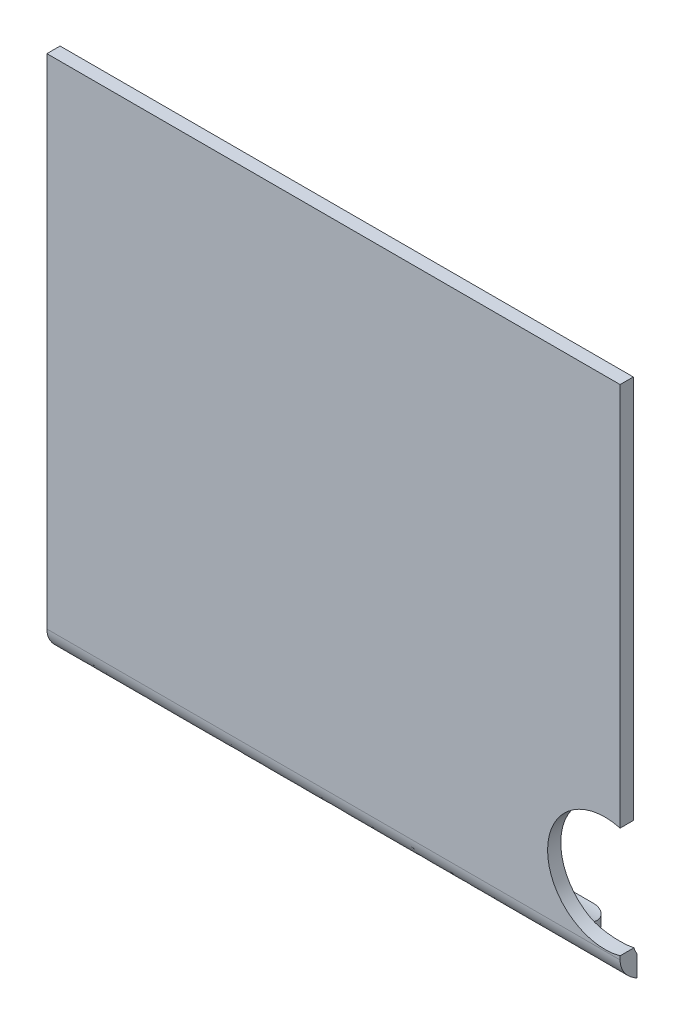
ISO-10303-21;
HEADER;
FILE_DESCRIPTION(('STEP AP214'),'2;1');
FILE_NAME('part.step','',(''),(''),'','','');
FILE_SCHEMA(('AUTOMOTIVE_DESIGN { 1 0 10303 214 1 1 1 1 }'));
ENDSEC;
DATA;
#1=APPLICATION_CONTEXT('core data for automotive mechanical design processes');
#2=APPLICATION_PROTOCOL_DEFINITION('international standard','automotive_design',2000,#1);
#3=PRODUCT_CONTEXT('',#1,'mechanical');
#4=PRODUCT('Part','Part','',(#3));
#5=PRODUCT_RELATED_PRODUCT_CATEGORY('part','',(#4));
#6=PRODUCT_DEFINITION_FORMATION('','',#4);
#7=PRODUCT_DEFINITION_CONTEXT('part definition',#1,'design');
#8=PRODUCT_DEFINITION('design','',#6,#7);
#9=PRODUCT_DEFINITION_SHAPE('','',#8);
#10=(LENGTH_UNIT() NAMED_UNIT(*) SI_UNIT(.MILLI.,.METRE.));
#11=(NAMED_UNIT(*) PLANE_ANGLE_UNIT() SI_UNIT($,.RADIAN.));
#12=(NAMED_UNIT(*) SI_UNIT($,.STERADIAN.) SOLID_ANGLE_UNIT());
#13=UNCERTAINTY_MEASURE_WITH_UNIT(LENGTH_MEASURE(1.E-05),#10,'distance_accuracy_value','');
#14=(GEOMETRIC_REPRESENTATION_CONTEXT(3) GLOBAL_UNCERTAINTY_ASSIGNED_CONTEXT((#13)) GLOBAL_UNIT_ASSIGNED_CONTEXT((#10,
#11,#12)) REPRESENTATION_CONTEXT('',''));
#15=CARTESIAN_POINT('',(0.,0.,0.));
#16=DIRECTION('',(0.,0.,1.));
#17=DIRECTION('',(1.,0.,0.));
#18=AXIS2_PLACEMENT_3D('',#15,#16,#17);
#19=CARTESIAN_POINT('',(0.,0.,0.));
#20=DIRECTION('',(1.,0.,0.));
#21=DIRECTION('',(0.,0.,-1.));
#22=AXIS2_PLACEMENT_3D('',#19,#20,#21);
#23=PLANE('',#22);
#24=CARTESIAN_POINT('',(0.,14.718910613293,210.450026632189));
#25=CARTESIAN_POINT('',(0.,30.718910613293,210.450026632189));
#26=CARTESIAN_POINT('',(0.,30.718910613293,233.450026632189));
#27=CARTESIAN_POINT('',(0.,14.718910613293,233.450026632189));
#28=CARTESIAN_POINT('',(0.,-1.28108938670694,233.450026632189));
#29=CARTESIAN_POINT('',(0.,-1.28108938670694,210.450026632189));
#30=CARTESIAN_POINT('',(0.,14.718910613293,210.450026632189));
#31=(BOUNDED_CURVE() B_SPLINE_CURVE(3,(#24,#25,#26,#27,#28,#29,#30),.UNSPECIFIED.,.T.,
.F.) B_SPLINE_CURVE_WITH_KNOTS((4,3,4),(0.,0.5,1.),
.UNSPECIFIED.) CURVE() GEOMETRIC_REPRESENTATION_ITEM() RATIONAL_B_SPLINE_CURVE((1.,
0.333333333333333,0.333333333333333,1.,0.333333333333333,0.333333333333333,1.)) REPRESENTATION_ITEM(''));
#32=CARTESIAN_POINT('',(0.,6.71891061329305,221.950026632189));
#33=VERTEX_POINT('',#32);
#34=CARTESIAN_POINT('',(0.,14.718910613293,233.450026632189));
#35=VERTEX_POINT('',#34);
#36=EDGE_CURVE('E161',#33,#35,#31,.F.);
#37=ORIENTED_EDGE('',*,*,#36,.T.);
#38=DIRECTION('',(0.,1.,0.));
#39=VECTOR('',#38,1.);
#40=CARTESIAN_POINT('',(0.,25.118910613293,233.450026632189));
#41=LINE('',#40,#39);
#42=CARTESIAN_POINT('',(0.,145.118910613293,233.450026632189));
#43=VERTEX_POINT('',#42);
#44=EDGE_CURVE('E168',#35,#43,#41,.T.);
#45=ORIENTED_EDGE('',*,*,#44,.T.);
#46=DIRECTION('',(0.,0.,1.));
#47=VECTOR('',#46,1.);
#48=CARTESIAN_POINT('',(0.,145.118910613293,230.000026632189));
#49=LINE('',#48,#47);
#50=CARTESIAN_POINT('',(0.,145.118910613293,230.000026632189));
#51=VERTEX_POINT('',#50);
#52=EDGE_CURVE('E149',#51,#43,#49,.T.);
#53=ORIENTED_EDGE('',*,*,#52,.F.);
#54=DIRECTION('',(0.,1.,0.));
#55=VECTOR('',#54,1.);
#56=CARTESIAN_POINT('',(0.,25.118910613293,230.000026632189));
#57=LINE('',#56,#55);
#58=CARTESIAN_POINT('',(0.,17.1189106132931,230.000026632189));
#59=VERTEX_POINT('',#58);
#60=EDGE_CURVE('E214',#59,#51,#57,.T.);
#61=ORIENTED_EDGE('',*,*,#60,.F.);
#62=CARTESIAN_POINT('',(0.,9.11891061329312,218.500026632189));
#63=CARTESIAN_POINT('',(0.,9.11891061329312,241.500026632189));
#64=CARTESIAN_POINT('',(0.,25.1189106132931,241.500026632189));
#65=CARTESIAN_POINT('',(0.,25.1189106132931,218.500026632189));
#66=CARTESIAN_POINT('',(0.,25.1189106132931,195.500026632189));
#67=CARTESIAN_POINT('',(0.,9.11891061329312,195.500026632189));
#68=CARTESIAN_POINT('',(0.,9.11891061329312,218.500026632189));
#69=(BOUNDED_CURVE() B_SPLINE_CURVE(3,(#62,#63,#64,#65,#66,#67,#68),.UNSPECIFIED.,.T.,
.F.) B_SPLINE_CURVE_WITH_KNOTS((4,3,4),(0.,0.5,1.),
.UNSPECIFIED.) CURVE() GEOMETRIC_REPRESENTATION_ITEM() RATIONAL_B_SPLINE_CURVE((1.,
0.333333333333333,0.333333333333333,1.,0.333333333333333,0.333333333333333,1.)) REPRESENTATION_ITEM(''));
#70=CARTESIAN_POINT('',(0.,9.11891061329312,218.500026632189));
#71=VERTEX_POINT('',#70);
#72=EDGE_CURVE('E213',#71,#59,#69,.T.);
#73=ORIENTED_EDGE('',*,*,#72,.F.);
#74=DIRECTION('',(0.,1.,0.));
#75=VECTOR('',#74,1.);
#76=CARTESIAN_POINT('',(0.,-59.3810893867069,218.500026632189));
#77=LINE('',#76,#75);
#78=CARTESIAN_POINT('',(0.,6.71891061329305,218.500026632189));
#79=VERTEX_POINT('',#78);
#80=EDGE_CURVE('E221',#79,#71,#77,.T.);
#81=ORIENTED_EDGE('',*,*,#80,.F.);
#82=DIRECTION('',(0.,0.,1.));
#83=VECTOR('',#82,1.);
#84=CARTESIAN_POINT('',(0.,6.71891061329305,-202.589640738144));
#85=LINE('',#84,#83);
#86=EDGE_CURVE('E208',#79,#33,#85,.T.);
#87=ORIENTED_EDGE('',*,*,#86,.T.);
#88=EDGE_LOOP('',(#37,#45,#53,#61,#73,#81,#87));
#89=FACE_BOUND('',#88,.T.);
#90=ADVANCED_FACE('F34',(#89),#23,.F.);
#91=CARTESIAN_POINT('',(150.,0.,0.));
#92=DIRECTION('',(1.,0.,0.));
#93=DIRECTION('',(0.,0.,-1.));
#94=AXIS2_PLACEMENT_3D('',#91,#92,#93);
#95=PLANE('',#94);
#96=DIRECTION('',(0.,1.,0.));
#97=VECTOR('',#96,1.);
#98=CARTESIAN_POINT('',(150.,25.118910613293,233.450026632189));
#99=LINE('',#98,#97);
#100=CARTESIAN_POINT('',(150.,44.5820382074938,233.450026632189));
#101=VERTEX_POINT('',#100);
#102=CARTESIAN_POINT('',(150.,145.118910613293,233.450026632189));
#103=VERTEX_POINT('',#102);
#104=EDGE_CURVE('E134',#101,#103,#99,.T.);
#105=ORIENTED_EDGE('',*,*,#104,.F.);
#106=DIRECTION('',(0.,0.,1.));
#107=VECTOR('',#106,1.);
#108=CARTESIAN_POINT('',(150.,44.5820382074938,-310.549973367811));
#109=LINE('',#108,#107);
#110=CARTESIAN_POINT('',(150.,44.5820382074938,230.000026632189));
#111=VERTEX_POINT('',#110);
#112=EDGE_CURVE('E146',#101,#111,#109,.F.);
#113=ORIENTED_EDGE('',*,*,#112,.T.);
#114=DIRECTION('',(0.,1.,0.));
#115=VECTOR('',#114,1.);
#116=CARTESIAN_POINT('',(150.,25.118910613293,230.000026632189));
#117=LINE('',#116,#115);
#118=CARTESIAN_POINT('',(150.,145.118910613293,230.000026632189));
#119=VERTEX_POINT('',#118);
#120=EDGE_CURVE('E162',#111,#119,#117,.T.);
#121=ORIENTED_EDGE('',*,*,#120,.T.);
#122=DIRECTION('',(0.,0.,1.));
#123=VECTOR('',#122,1.);
#124=CARTESIAN_POINT('',(150.,145.118910613293,230.000026632189));
#125=LINE('',#124,#123);
#126=EDGE_CURVE('E148',#119,#103,#125,.T.);
#127=ORIENTED_EDGE('',*,*,#126,.T.);
#128=EDGE_LOOP('',(#105,#113,#121,#127));
#129=FACE_BOUND('',#128,.T.);
#130=ADVANCED_FACE('F144',(#129),#95,.T.);
#131=CARTESIAN_POINT('',(150.,14.718910613293,210.450026632189));
#132=CARTESIAN_POINT('',(150.,30.718910613293,210.450026632189));
#133=CARTESIAN_POINT('',(150.,30.718910613293,233.450026632189));
#134=CARTESIAN_POINT('',(150.,14.718910613293,233.450026632189));
#135=CARTESIAN_POINT('',(150.,-1.28108938670694,233.450026632189));
#136=CARTESIAN_POINT('',(150.,-1.28108938670694,210.450026632189));
#137=CARTESIAN_POINT('',(150.,14.718910613293,210.450026632189));
#138=(BOUNDED_CURVE() B_SPLINE_CURVE(3,(#131,#132,#133,#134,#135,#136,#137),.UNSPECIFIED.,.T.,
.F.) B_SPLINE_CURVE_WITH_KNOTS((4,3,4),(0.,0.5,1.),
.UNSPECIFIED.) CURVE() GEOMETRIC_REPRESENTATION_ITEM() RATIONAL_B_SPLINE_CURVE((1.,
0.333333333333333,0.333333333333333,1.,0.333333333333333,0.333333333333333,1.)) REPRESENTATION_ITEM(''));
#139=CARTESIAN_POINT('',(150.,8.39851723939905,229.000026632188));
#140=VERTEX_POINT('',#139);
#141=CARTESIAN_POINT('',(150.,14.718910613293,233.450026632189));
#142=VERTEX_POINT('',#141);
#143=EDGE_CURVE('E209',#140,#142,#138,.F.);
#144=ORIENTED_EDGE('',*,*,#143,.F.);
#145=DIRECTION('',(0.,1.,0.));
#146=VECTOR('',#145,1.);
#147=CARTESIAN_POINT('',(150.,-59.3810893867069,229.000026632188));
#148=LINE('',#147,#146);
#149=CARTESIAN_POINT('',(150.,13.8560126934145,229.000026632188));
#150=VERTEX_POINT('',#149);
#151=EDGE_CURVE('E152',#140,#150,#148,.T.);
#152=ORIENTED_EDGE('',*,*,#151,.T.);
#153=CARTESIAN_POINT('',(150.,9.11891061329316,218.500026632189));
#154=CARTESIAN_POINT('',(150.,9.11891061329316,241.500026632189));
#155=CARTESIAN_POINT('',(150.,25.1189106132932,241.500026632189));
#156=CARTESIAN_POINT('',(150.,25.1189106132932,218.500026632189));
#157=CARTESIAN_POINT('',(150.,25.1189106132932,195.500026632189));
#158=CARTESIAN_POINT('',(150.,9.11891061329316,195.500026632189));
#159=CARTESIAN_POINT('',(150.,9.11891061329316,218.500026632189));
#160=(BOUNDED_CURVE() B_SPLINE_CURVE(3,(#153,#154,#155,#156,#157,#158,#159),.UNSPECIFIED.,.T.,
.F.) B_SPLINE_CURVE_WITH_KNOTS((4,3,4),(0.,0.5,1.),
.UNSPECIFIED.) CURVE() GEOMETRIC_REPRESENTATION_ITEM() RATIONAL_B_SPLINE_CURVE((1.,
0.333333333333333,0.333333333333333,1.,0.333333333333333,0.333333333333333,1.)) REPRESENTATION_ITEM(''));
#161=CARTESIAN_POINT('',(150.,15.6557830190929,229.8060585008));
#162=VERTEX_POINT('',#161);
#163=EDGE_CURVE('E154',#150,#162,#160,.T.);
#164=ORIENTED_EDGE('',*,*,#163,.T.);
#165=DIRECTION('',(0.,0.,1.));
#166=VECTOR('',#165,1.);
#167=CARTESIAN_POINT('',(150.,15.6557830190929,-310.549973367811));
#168=LINE('',#167,#166);
#169=CARTESIAN_POINT('',(150.,15.6557830190929,233.450026632189));
#170=VERTEX_POINT('',#169);
#171=EDGE_CURVE('E38',#162,#170,#168,.T.);
#172=ORIENTED_EDGE('',*,*,#171,.T.);
#173=EDGE_CURVE('E137',#142,#170,#99,.T.);
#174=ORIENTED_EDGE('',*,*,#173,.F.);
#175=EDGE_LOOP('',(#144,#152,#164,#172,#174));
#176=FACE_BOUND('',#175,.T.);
#177=ADVANCED_FACE('F321',(#176),#95,.T.);
#178=CARTESIAN_POINT('',(-199.506364446809,145.118910613293,230.000026632189));
#179=DIRECTION('',(0.,-1.,0.));
#180=DIRECTION('',(1.,0.,0.));
#181=AXIS2_PLACEMENT_3D('',#178,#179,#180);
#182=PLANE('',#181);
#183=DIRECTION('',(1.,0.,0.));
#184=VECTOR('',#183,1.);
#185=CARTESIAN_POINT('',(-262.506364446809,145.118910613293,230.000026632189));
#186=LINE('',#185,#184);
#187=EDGE_CURVE('E194',#51,#119,#186,.T.);
#188=ORIENTED_EDGE('',*,*,#187,.F.);
#189=ORIENTED_EDGE('',*,*,#52,.T.);
#190=DIRECTION('',(1.,0.,0.));
#191=VECTOR('',#190,1.);
#192=CARTESIAN_POINT('',(-262.506364446809,145.118910613293,233.450026632189));
#193=LINE('',#192,#191);
#194=EDGE_CURVE('E334',#43,#103,#193,.T.);
#195=ORIENTED_EDGE('',*,*,#194,.T.);
#196=ORIENTED_EDGE('',*,*,#126,.F.);
#197=EDGE_LOOP('',(#188,#189,#195,#196));
#198=FACE_BOUND('',#197,.T.);
#199=ADVANCED_FACE('F325',(#198),#182,.F.);
#200=CARTESIAN_POINT('',(133.022822584558,-59.3810893867069,224.000026632188));
#201=DIRECTION('',(-1.,0.,0.));
#202=DIRECTION('',(0.,-1.,0.));
#203=AXIS2_PLACEMENT_3D('',#200,#201,#202);
#204=PLANE('',#203);
#205=CARTESIAN_POINT('',(133.022822584558,14.718910613293,210.450026632189));
#206=CARTESIAN_POINT('',(133.022822584558,30.718910613293,210.450026632189));
#207=CARTESIAN_POINT('',(133.022822584558,30.718910613293,233.450026632189));
#208=CARTESIAN_POINT('',(133.022822584558,14.718910613293,233.450026632189));
#209=CARTESIAN_POINT('',(133.022822584558,-1.28108938670694,233.450026632189));
#210=CARTESIAN_POINT('',(133.022822584558,-1.28108938670694,210.450026632189));
#211=CARTESIAN_POINT('',(133.022822584558,14.718910613293,210.450026632189));
#212=(BOUNDED_CURVE() B_SPLINE_CURVE(3,(#205,#206,#207,#208,#209,#210,#211),.UNSPECIFIED.,.T.,
.F.) B_SPLINE_CURVE_WITH_KNOTS((4,3,4),(0.,0.5,1.),
.UNSPECIFIED.) CURVE() GEOMETRIC_REPRESENTATION_ITEM() RATIONAL_B_SPLINE_CURVE((1.,
0.333333333333333,0.333333333333333,1.,0.333333333333333,0.333333333333333,1.)) REPRESENTATION_ITEM(''));
#213=CARTESIAN_POINT('',(133.022822584558,6.84704450718837,224.000026632188));
#214=VERTEX_POINT('',#213);
#215=CARTESIAN_POINT('',(133.022822584558,6.79190906812072,223.500026632189));
#216=VERTEX_POINT('',#215);
#217=EDGE_CURVE('E360',#214,#216,#212,.T.);
#218=ORIENTED_EDGE('',*,*,#217,.T.);
#219=DIRECTION('',(0.,1.,0.));
#220=VECTOR('',#219,1.);
#221=CARTESIAN_POINT('',(133.022822584558,-59.3810893867069,223.500026632189));
#222=LINE('',#221,#220);
#223=CARTESIAN_POINT('',(133.022822584558,9.91462707339474,223.500026632189));
#224=VERTEX_POINT('',#223);
#225=EDGE_CURVE('E337',#216,#224,#222,.T.);
#226=ORIENTED_EDGE('',*,*,#225,.T.);
#227=CARTESIAN_POINT('',(133.022822584558,9.11891061329316,218.500026632189));
#228=CARTESIAN_POINT('',(133.022822584558,9.11891061329316,241.500026632189));
#229=CARTESIAN_POINT('',(133.022822584558,25.1189106132932,241.500026632189));
#230=CARTESIAN_POINT('',(133.022822584558,25.1189106132932,218.500026632189));
#231=CARTESIAN_POINT('',(133.022822584558,25.1189106132932,195.500026632189));
#232=CARTESIAN_POINT('',(133.022822584558,9.11891061329316,195.500026632189));
#233=CARTESIAN_POINT('',(133.022822584558,9.11891061329316,218.500026632189));
#234=(BOUNDED_CURVE() B_SPLINE_CURVE(3,(#227,#228,#229,#230,#231,#232,#233),.UNSPECIFIED.,.T.,
.F.) B_SPLINE_CURVE_WITH_KNOTS((4,3,4),(0.,0.5,1.),
.UNSPECIFIED.) CURVE() GEOMETRIC_REPRESENTATION_ITEM() RATIONAL_B_SPLINE_CURVE((1.,
0.333333333333333,0.333333333333333,1.,0.333333333333333,0.333333333333333,1.)) REPRESENTATION_ITEM(''));
#235=CARTESIAN_POINT('',(133.022822584558,10.0931680474759,224.000026632188));
#236=VERTEX_POINT('',#235);
#237=EDGE_CURVE('E276',#236,#224,#234,.F.);
#238=ORIENTED_EDGE('',*,*,#237,.F.);
#239=DIRECTION('',(0.,1.,0.));
#240=VECTOR('',#239,1.);
#241=CARTESIAN_POINT('',(133.022822584558,-59.3810893867069,224.000026632188));
#242=LINE('',#241,#240);
#243=EDGE_CURVE('E339',#214,#236,#242,.T.);
#244=ORIENTED_EDGE('',*,*,#243,.F.);
#245=EDGE_LOOP('',(#218,#226,#238,#244));
#246=FACE_BOUND('',#245,.T.);
#247=ADVANCED_FACE('F289',(#246),#204,.F.);
#248=CARTESIAN_POINT('',(128.022822584558,-59.3810893867069,223.500026632189));
#249=DIRECTION('',(0.,1.,0.));
#250=DIRECTION('',(-1.,0.,0.));
#251=AXIS2_PLACEMENT_3D('',#248,#249,#250);
#252=CYLINDRICAL_SURFACE('',#251,5.);
#253=CARTESIAN_POINT('',(128.022822584558,6.71891061329305,223.500026632189));
#254=DIRECTION('',(0.,-1.,0.));
#255=DIRECTION('',(0.,0.,-1.));
#256=AXIS2_PLACEMENT_3D('',#253,#254,#255);
#257=CIRCLE('',#256,5.);
#258=CARTESIAN_POINT('',(132.776505367412,6.71891061329305,221.950026632189));
#259=VERTEX_POINT('',#258);
#260=CARTESIAN_POINT('',(128.022822584558,6.71891061329305,218.500026632189));
#261=VERTEX_POINT('',#260);
#262=EDGE_CURVE('E58',#259,#261,#257,.F.);
#263=ORIENTED_EDGE('',*,*,#262,.T.);
#264=DIRECTION('',(0.,1.,0.));
#265=VECTOR('',#264,1.);
#266=CARTESIAN_POINT('',(128.022822584558,-59.3810893867069,218.500026632189));
#267=LINE('',#266,#265);
#268=CARTESIAN_POINT('',(128.022822584558,9.11891061329312,218.500026632189));
#269=VERTEX_POINT('',#268);
#270=EDGE_CURVE('E298',#261,#269,#267,.T.);
#271=ORIENTED_EDGE('',*,*,#270,.T.);
#272=CARTESIAN_POINT('',(133.022822584558,9.91462707339474,223.500026632189));
#273=CARTESIAN_POINT('',(133.022840835873,9.87027749899131,223.368029655093));
#274=CARTESIAN_POINT('',(133.017595868184,9.82789737165117,223.235353445482));
#275=CARTESIAN_POINT('',(132.996390223536,9.74717069250829,222.969602821246));
#276=CARTESIAN_POINT('',(132.98042730374,9.70882498689075,222.83652832908));
#277=CARTESIAN_POINT('',(132.937601977038,9.63629006958103,222.571032565645));
#278=CARTESIAN_POINT('',(132.910742450999,9.60209976237898,222.438611131079));
#279=CARTESIAN_POINT('',(132.846084676911,9.5378760432228,222.175452828112));
#280=CARTESIAN_POINT('',(132.80828749099,9.50784222806031,222.044715797429));
#281=CARTESIAN_POINT('',(132.721748789894,9.45181084166113,221.785743596374));
#282=CARTESIAN_POINT('',(132.672987033915,9.4258208875459,221.657513535941));
#283=CARTESIAN_POINT('',(132.564765978702,9.37780000975867,221.404881364192));
#284=CARTESIAN_POINT('',(132.505306616702,9.35576910931738,221.280479275341));
#285=CARTESIAN_POINT('',(132.376058836384,9.31546082712888,221.036621173838));
#286=CARTESIAN_POINT('',(132.30627637594,9.29718129474802,220.91716235878));
#287=CARTESIAN_POINT('',(132.156802907943,9.26407913805962,220.684112995405));
#288=CARTESIAN_POINT('',(132.077112145904,9.24925642812248,220.570522301781));
#289=CARTESIAN_POINT('',(131.910098883754,9.22300653529225,220.352398437532));
#290=CARTESIAN_POINT('',(131.822966395179,9.21151595521464,220.247727295571));
#291=CARTESIAN_POINT('',(131.640279020766,9.19117938260808,220.045672065378));
#292=CARTESIAN_POINT('',(131.544721279458,9.18233429117822,219.948290468541));
#293=CARTESIAN_POINT('',(131.345869590312,9.16692418094131,219.761583212651));
#294=CARTESIAN_POINT('',(131.242575731714,9.16035913583753,219.672257460697));
#295=CARTESIAN_POINT('',(131.028925865848,9.14912925180317,219.502279096432));
#296=CARTESIAN_POINT('',(130.918567272809,9.1444651132797,219.421629689045));
#297=CARTESIAN_POINT('',(130.690336450424,9.13662532928937,219.268781195561));
#298=CARTESIAN_POINT('',(130.572395156605,9.13346654906286,219.196684355505));
#299=CARTESIAN_POINT('',(130.330884996805,9.12834734582538,219.062466074235));
#300=CARTESIAN_POINT('',(130.207313938187,9.12638739408645,219.000348563065));
#301=CARTESIAN_POINT('',(129.955517463697,9.1233335093016,218.886594499935));
#302=CARTESIAN_POINT('',(129.827295136142,9.1222390122392,218.834951138321));
#303=CARTESIAN_POINT('',(129.567009404984,9.1206238252069,218.742444304486));
#304=CARTESIAN_POINT('',(129.434945017502,9.12010328356774,218.701583620972));
#305=CARTESIAN_POINT('',(129.092984809388,9.11918973347901,218.611148581779));
#306=CARTESIAN_POINT('',(128.880908891738,9.1190312852206,218.569503252731));
#307=CARTESIAN_POINT('',(128.560377262727,9.11892916376741,218.527836566824));
#308=CARTESIAN_POINT('',(128.45315415817,9.11891770279374,218.517414562795));
#309=CARTESIAN_POINT('',(128.238241194015,9.11891011163272,218.503510147622));
#310=CARTESIAN_POINT('',(128.13055126082,9.1189139839575,218.500028873744));
#311=CARTESIAN_POINT('',(128.022822584558,9.11891061329315,218.500026632189));
#312=B_SPLINE_CURVE_WITH_KNOTS('',3,(#272,#273,#274,#275,#276,#277,#278,#279,#280,#281,#282,
#283,#284,#285,#286,#287,#288,#289,#290,#291,#292,#293,#294,#295,#296,#297,#298,#299,#300,#301,
#302,#303,#304,#305,#306,#307,#308,#309,#310,#311),.UNSPECIFIED.,.F.,.F.,(4,2,2,2,2,2,2,2,2,2,2,
2,2,2,2,2,2,2,2,4),(0.,0.41765519203846,0.835397809753469,1.25303005575201,1.67062176010674,
2.08899076921459,2.50736223312434,2.92549317334825,3.34361375486892,3.75316014609624,
4.16284587743923,4.57252688354701,4.98235870434473,5.39667998699728,5.81116403918589,
6.22537774915175,6.63969848178812,7.28598036041397,7.60897995116174,7.93203246239583),.UNSPECIFIED.);
#313=EDGE_CURVE('E182',#224,#269,#312,.T.);
#314=ORIENTED_EDGE('',*,*,#313,.F.);
#315=ORIENTED_EDGE('',*,*,#225,.F.);
#316=CARTESIAN_POINT('',(133.022822584558,6.79190906812072,223.500026632189));
#317=CARTESIAN_POINT('',(133.02282359179,6.78567676772479,223.434172608672));
#318=CARTESIAN_POINT('',(133.021521590442,6.77984699261239,223.368280342207));
#319=CARTESIAN_POINT('',(133.016322897669,6.7690214998857,223.236864189699));
#320=CARTESIAN_POINT('',(133.012439300571,6.76402173145925,223.171340118978));
#321=CARTESIAN_POINT('',(133.00210610238,6.75483794622798,223.040659738276));
#322=CARTESIAN_POINT('',(132.99566516192,6.75065124644688,222.97550293222));
#323=CARTESIAN_POINT('',(132.980235550345,6.74307509304339,222.845557176602));
#324=CARTESIAN_POINT('',(132.97125120311,6.73968430408774,222.780767791467));
#325=CARTESIAN_POINT('',(132.950740738425,6.73368270879883,222.651556404822));
#326=CARTESIAN_POINT('',(132.939214626165,6.7310719008729,222.587134402562));
#327=CARTESIAN_POINT('',(132.913614934155,6.72661373777545,222.458658303475));
#328=CARTESIAN_POINT('',(132.899537070886,6.72476768374969,222.394605015024));
#329=CARTESIAN_POINT('',(132.868816334453,6.72182364738658,222.266870776281));
#330=CARTESIAN_POINT('',(132.852164978079,6.72072820671075,222.203191807891));
#331=CARTESIAN_POINT('',(132.816269260044,6.71926945601992,222.07621251356));
#332=CARTESIAN_POINT('',(132.797012211651,6.71890987632175,222.012915730779));
#333=CARTESIAN_POINT('',(132.776505367412,6.71891061329305,221.950026632189));
#334=B_SPLINE_CURVE_WITH_KNOTS('',3,(#316,#317,#318,#319,#320,#321,#322,#323,#324,#325,#326,
#327,#328,#329,#330,#331,#332,#333),.UNSPECIFIED.,.F.,.F.,(4,2,2,2,2,2,2,2,4),(0.,
0.198430947709576,0.395863019628154,0.592632099367047,0.789068653210348,0.985504805939279,
1.1822738142804,1.3797058551347,1.57813628806702),.UNSPECIFIED.);
#335=EDGE_CURVE('E245',#216,#259,#334,.T.);
#336=ORIENTED_EDGE('',*,*,#335,.T.);
#337=EDGE_LOOP('',(#263,#271,#314,#315,#336));
#338=FACE_BOUND('',#337,.T.);
#339=ADVANCED_FACE('F285',(#338),#252,.T.);
#340=CARTESIAN_POINT('',(-262.506364446809,25.118910613293,230.000026632189));
#341=DIRECTION('',(0.,0.,1.));
#342=DIRECTION('',(0.,-1.,0.));
#343=AXIS2_PLACEMENT_3D('',#340,#341,#342);
#344=PLANE('',#343);
#345=DIRECTION('',(1.,0.,0.));
#346=VECTOR('',#345,1.);
#347=CARTESIAN_POINT('',(-208.506364446809,17.1189106132931,230.000026632189));
#348=LINE('',#347,#346);
#349=CARTESIAN_POINT('',(138.539507811013,17.1189106132932,230.000026632189));
#350=VERTEX_POINT('',#349);
#351=EDGE_CURVE('E178',#350,#59,#348,.F.);
#352=ORIENTED_EDGE('',*,*,#351,.T.);
#353=ORIENTED_EDGE('',*,*,#60,.T.);
#354=ORIENTED_EDGE('',*,*,#187,.T.);
#355=ORIENTED_EDGE('',*,*,#120,.F.);
#356=CARTESIAN_POINT('',(146.022822584561,30.1189106132933,230.000026632189));
#357=DIRECTION('',(0.,0.,1.));
#358=DIRECTION('',(0.,-1.,0.));
#359=AXIS2_PLACEMENT_3D('',#356,#357,#358);
#360=CIRCLE('',#359,15.);
#361=EDGE_CURVE('E43',#111,#350,#360,.T.);
#362=ORIENTED_EDGE('',*,*,#361,.T.);
#363=EDGE_LOOP('',(#352,#353,#354,#355,#362));
#364=FACE_BOUND('',#363,.T.);
#365=ADVANCED_FACE('F262',(#364),#344,.F.);
#366=CARTESIAN_POINT('',(-304.054799780113,9.11891061329305,218.500026632189));
#367=CARTESIAN_POINT('',(-304.054799780113,9.11891061329304,241.500026632189));
#368=CARTESIAN_POINT('',(-304.054799780113,25.118910613293,241.500026632189));
#369=CARTESIAN_POINT('',(-304.054799780113,25.118910613293,218.500026632189));
#370=CARTESIAN_POINT('',(-304.054799780113,25.118910613293,195.500026632189));
#371=CARTESIAN_POINT('',(-304.054799780113,9.11891061329304,195.500026632189));
#372=CARTESIAN_POINT('',(-304.054799780113,9.11891061329305,218.500026632189));
#373=(BOUNDED_CURVE() B_SPLINE_CURVE(3,(#366,#367,#368,#369,#370,#371,#372),.UNSPECIFIED.,.T.,
.F.) B_SPLINE_CURVE_WITH_KNOTS((4,3,4),(0.,0.5,1.),
.UNSPECIFIED.) CURVE() GEOMETRIC_REPRESENTATION_ITEM() RATIONAL_B_SPLINE_CURVE((1.,
0.333333333333333,0.333333333333333,1.,0.333333333333333,0.333333333333333,1.)) REPRESENTATION_ITEM(''));
#374=DIRECTION('',(-1.,0.,0.));
#375=VECTOR('',#374,1.);
#376=SURFACE_OF_LINEAR_EXTRUSION('',#373,#375);
#377=DIRECTION('',(1.,0.,0.));
#378=VECTOR('',#377,1.);
#379=CARTESIAN_POINT('',(205.493635553191,9.11891061329317,218.500026632189));
#380=LINE('',#379,#378);
#381=EDGE_CURVE('E195',#71,#269,#380,.T.);
#382=ORIENTED_EDGE('',*,*,#381,.F.);
#383=ORIENTED_EDGE('',*,*,#72,.T.);
#384=ORIENTED_EDGE('',*,*,#351,.F.);
#385=CARTESIAN_POINT('',(138.539507811013,17.1189106132932,230.000026632189));
#386=CARTESIAN_POINT('',(138.710350042799,17.0205629130992,230.000016479904));
#387=CARTESIAN_POINT('',(138.883112820276,16.9256015163136,229.997419527962));
#388=CARTESIAN_POINT('',(139.232020642757,16.7426724111915,229.988057172344));
#389=CARTESIAN_POINT('',(139.408162894945,16.6546992127641,229.981295078207));
#390=CARTESIAN_POINT('',(139.763591769324,16.485835373533,229.964606795916));
#391=CARTESIAN_POINT('',(139.94287747043,16.4049426983077,229.954681520458));
#392=CARTESIAN_POINT('',(140.304365356509,16.2503169689872,229.932588335206));
#393=CARTESIAN_POINT('',(140.486567460693,16.1765837169661,229.920420487435));
#394=CARTESIAN_POINT('',(140.85392635271,16.0362533963668,229.894684296707));
#395=CARTESIAN_POINT('',(141.03908730104,15.9696676229949,229.881113801674));
#396=CARTESIAN_POINT('',(141.411863257682,15.8438359278122,229.853386389901));
#397=CARTESIAN_POINT('',(141.599478514149,15.7845907546479,229.839229413544));
#398=CARTESIAN_POINT('',(141.976921454008,15.6735173787559,229.811061865102));
#399=CARTESIAN_POINT('',(142.166749321565,15.6216897982659,229.797051305391));
#400=CARTESIAN_POINT('',(142.548361444481,15.5255270109826,229.769836630317));
#401=CARTESIAN_POINT('',(142.740145842742,15.4811923556712,229.756632574359));
#402=CARTESIAN_POINT('',(143.200253503746,15.3843321465641,229.726760933655));
#403=CARTESIAN_POINT('',(143.469366893289,15.3353155128501,229.710740570638));
#404=CARTESIAN_POINT('',(144.010065667112,15.2520469919588,229.682690790606));
#405=CARTESIAN_POINT('',(144.281650999441,15.2177947952145,229.670661289915));
#406=CARTESIAN_POINT('',(144.826456960422,15.1641915720876,229.651528580223));
#407=CARTESIAN_POINT('',(145.099677521189,15.1448399313698,229.644425168124));
#408=CARTESIAN_POINT('',(145.646591160193,15.1211341581232,229.635692373942));
#409=CARTESIAN_POINT('',(145.920283524234,15.1167655144047,229.634057695371));
#410=CARTESIAN_POINT('',(146.4674881883,15.1230066184848,229.636373721515));
#411=CARTESIAN_POINT('',(146.741000480638,15.1336169688924,229.64032465094));
#412=CARTESIAN_POINT('',(147.286865610142,15.169762552285,229.653503066801));
#413=CARTESIAN_POINT('',(147.559218552755,15.1952963973943,229.662730062564));
#414=CARTESIAN_POINT('',(148.228710211142,15.2765783014518,229.691162448171));
#415=CARTESIAN_POINT('',(148.624728420433,15.3408676631039,229.713015423734));
#416=CARTESIAN_POINT('',(149.41000018071,15.5008504258687,229.7629598315));
#417=CARTESIAN_POINT('',(149.799252264914,15.5965505490681,229.791052598637));
#418=CARTESIAN_POINT('',(150.568368776843,15.8186282290897,229.848265230908));
#419=CARTESIAN_POINT('',(150.948242632609,15.9449734685498,229.877383986596));
#420=CARTESIAN_POINT('',(151.696838349125,16.2277099423999,229.930282099936));
#421=CARTESIAN_POINT('',(152.065567233513,16.3840817767489,229.954064883736));
#422=CARTESIAN_POINT('',(152.611108555209,16.6416826140469,229.980223567225));
#423=CARTESIAN_POINT('',(152.792869616942,16.7320639023054,229.987372118157));
#424=CARTESIAN_POINT('',(153.152467683538,16.9200739837091,229.997266658159));
#425=CARTESIAN_POINT('',(153.330308773488,17.0176947194122,230.000017467155));
#426=CARTESIAN_POINT('',(153.506137358109,17.1189106132932,230.000026632189));
#427=B_SPLINE_CURVE_WITH_KNOTS('',3,(#385,#386,#387,#388,#389,#390,#391,#392,#393,#394,#395,
#396,#397,#398,#399,#400,#401,#402,#403,#404,#405,#406,#407,#408,#409,#410,#411,#412,#413,#414,
#415,#416,#417,#418,#419,#420,#421,#422,#423,#424,#425,#426),.UNSPECIFIED.,.F.,.F.,(4,2,2,2,2,2,
2,2,2,2,2,2,2,2,2,2,2,2,2,2,4),(0.,0.591292359741734,1.18211549521779,1.77276831046459,
2.36340479215301,2.95496132952327,3.5465781484593,4.13824456714244,4.72995451372927,
5.55153374303787,6.37309574540273,7.19462387377328,8.01535611851211,8.83612138247367,
9.65681032791516,10.8607501284606,12.0649477473405,13.2678809373673,14.4700395172494,
15.079204962882,15.6877023042666),.UNSPECIFIED.);
#428=EDGE_CURVE('E172',#350,#162,#427,.T.);
#429=ORIENTED_EDGE('',*,*,#428,.T.);
#430=ORIENTED_EDGE('',*,*,#163,.F.);
#431=DIRECTION('',(-1.,0.,0.));
#432=VECTOR('',#431,1.);
#433=CARTESIAN_POINT('',(-1.50636444680924,13.8560126934145,229.000026632188));
#434=LINE('',#433,#432);
#435=CARTESIAN_POINT('',(138.022822584558,13.8560126934152,229.000026632188));
#436=VERTEX_POINT('',#435);
#437=EDGE_CURVE('E169',#150,#436,#434,.T.);
#438=ORIENTED_EDGE('',*,*,#437,.T.);
#439=CARTESIAN_POINT('',(138.022822584558,13.8560126934152,229.000026632188));
#440=CARTESIAN_POINT('',(137.979557677244,13.8560152327775,229.000027383719));
#441=CARTESIAN_POINT('',(137.936299650852,13.8551377713727,228.999464903887));
#442=CARTESIAN_POINT('',(137.849888156671,13.8516475576175,228.997221887723));
#443=CARTESIAN_POINT('',(137.806734676055,13.8490350302173,228.995541496328));
#444=CARTESIAN_POINT('',(137.677723734652,13.8386455202645,228.988844839188));
#445=CARTESIAN_POINT('',(137.592140935365,13.8283164083379,228.982173017446));
#446=CARTESIAN_POINT('',(137.423643938302,13.8015270693031,228.964708335383));
#447=CARTESIAN_POINT('',(137.340709136505,13.7851551317345,228.953974765407));
#448=CARTESIAN_POINT('',(137.176690618758,13.7469327564261,228.928611876544));
#449=CARTESIAN_POINT('',(137.095607888596,13.7250794720373,228.913980533166));
#450=CARTESIAN_POINT('',(136.905888139967,13.6676432773391,228.874963138199));
#451=CARTESIAN_POINT('',(136.798211559367,13.6299763269655,228.848972737722));
#452=CARTESIAN_POINT('',(136.587321249014,13.5476499927495,228.790779808144));
#453=CARTESIAN_POINT('',(136.484109178888,13.5029880366276,228.758574992795));
#454=CARTESIAN_POINT('',(136.281487615971,13.4079945444599,228.688238732724));
#455=CARTESIAN_POINT('',(136.18210956465,13.357625734979,228.650067624049));
#456=CARTESIAN_POINT('',(135.987785643498,13.2528194160277,228.568367398667));
#457=CARTESIAN_POINT('',(135.892841360184,13.1983804680076,228.524836384005));
#458=CARTESIAN_POINT('',(135.656724961024,13.0560818326322,228.407655846238));
#459=CARTESIAN_POINT('',(135.518519883509,12.9661596441353,228.330509552079));
#460=CARTESIAN_POINT('',(135.251918690494,12.7821816972489,228.164965737064));
#461=CARTESIAN_POINT('',(135.123527300634,12.6881239813689,228.076562849701));
#462=CARTESIAN_POINT('',(134.876520823319,12.4980332342167,227.889088721357));
#463=CARTESIAN_POINT('',(134.757900350065,12.4020013281086,227.790023427983));
#464=CARTESIAN_POINT('',(134.530524875779,12.2095023669269,227.58159538518));
#465=CARTESIAN_POINT('',(134.421768245505,12.1130353864893,227.472234342436));
#466=CARTESIAN_POINT('',(134.211875505728,11.9184697175003,227.2406610908));
#467=CARTESIAN_POINT('',(134.111001285654,11.8203913647023,227.118194040634));
#468=CARTESIAN_POINT('',(133.920680424391,11.6262029853542,226.863196003778));
#469=CARTESIAN_POINT('',(133.831234620216,11.5300931034071,226.730664281084));
#470=CARTESIAN_POINT('',(133.664831499715,11.3410637406598,226.456362881032));
#471=CARTESIAN_POINT('',(133.587847211137,11.2481377220549,226.314614112196));
#472=CARTESIAN_POINT('',(133.447160392496,11.0661864262756,226.022305609561));
#473=CARTESIAN_POINT('',(133.38345527513,10.9771603919061,225.871747599483));
#474=CARTESIAN_POINT('',(133.278286833693,10.8158883468437,225.584153540876));
#475=CARTESIAN_POINT('',(133.234963812519,10.7430281220472,225.448140238945));
#476=CARTESIAN_POINT('',(133.15974867061,10.6013518432404,225.170977417921));
#477=CARTESIAN_POINT('',(133.127853258507,10.5325346295475,225.02982939065));
#478=CARTESIAN_POINT('',(133.076085466054,10.3990401075517,224.742458251022));
#479=CARTESIAN_POINT('',(133.056278898921,10.3343871451714,224.596211860918));
#480=CARTESIAN_POINT('',(133.029633255847,10.2099807789072,224.300344826246));
#481=CARTESIAN_POINT('',(133.022805623567,10.1502317432302,224.150721321529));
#482=CARTESIAN_POINT('',(133.022822584558,10.0931680474759,224.000026632188));
#483=B_SPLINE_CURVE_WITH_KNOTS('',3,(#439,#440,#441,#442,#443,#444,#445,#446,#447,#448,#449,
#450,#451,#452,#453,#454,#455,#456,#457,#458,#459,#460,#461,#462,#463,#464,#465,#466,#467,#468,
#469,#470,#471,#472,#473,#474,#475,#476,#477,#478,#479,#480,#481,#482),.UNSPECIFIED.,.F.,.F.,(4,
2,2,2,2,2,2,2,2,2,2,2,2,2,2,2,2,2,2,2,2,4),(0.,0.129768855646125,0.25952089013305,
0.518502599013405,0.773841243942161,1.02931277043056,1.37974231904349,1.73030103529541,
2.0832980190797,2.43642036134627,2.98174977693542,3.52734015503951,4.07262775882938,
4.61782513108957,5.17679423025926,5.73580424479897,6.29358764952205,6.8512622743726,
7.33155082631944,7.81170093458409,8.29444225291718,8.77760901218972),.UNSPECIFIED.);
#484=EDGE_CURVE('E171',#436,#236,#483,.T.);
#485=ORIENTED_EDGE('',*,*,#484,.T.);
#486=ORIENTED_EDGE('',*,*,#237,.T.);
#487=ORIENTED_EDGE('',*,*,#313,.T.);
#488=EDGE_LOOP('',(#382,#383,#384,#429,#430,#438,#485,#486,#487));
#489=FACE_BOUND('',#488,.T.);
#490=ADVANCED_FACE('F257',(#489),#376,.F.);
#491=CARTESIAN_POINT('',(-262.506364446809,25.118910613293,233.450026632189));
#492=DIRECTION('',(0.,0.,1.));
#493=DIRECTION('',(0.,-1.,0.));
#494=AXIS2_PLACEMENT_3D('',#491,#492,#493);
#495=PLANE('',#494);
#496=ORIENTED_EDGE('',*,*,#44,.F.);
#497=DIRECTION('',(1.,0.,0.));
#498=VECTOR('',#497,1.);
#499=CARTESIAN_POINT('',(-262.506364446809,14.718910613293,233.450026632189));
#500=LINE('',#499,#498);
#501=EDGE_CURVE('E181',#35,#142,#500,.T.);
#502=ORIENTED_EDGE('',*,*,#501,.T.);
#503=ORIENTED_EDGE('',*,*,#173,.T.);
#504=CARTESIAN_POINT('',(146.022822584561,30.1189106132933,233.450026632189));
#505=DIRECTION('',(0.,0.,1.));
#506=DIRECTION('',(1.,0.,0.));
#507=AXIS2_PLACEMENT_3D('',#504,#505,#506);
#508=CIRCLE('',#507,15.);
#509=EDGE_CURVE('E11',#101,#170,#508,.T.);
#510=ORIENTED_EDGE('',*,*,#509,.F.);
#511=ORIENTED_EDGE('',*,*,#104,.T.);
#512=ORIENTED_EDGE('',*,*,#194,.F.);
#513=EDGE_LOOP('',(#496,#502,#503,#510,#511,#512));
#514=FACE_BOUND('',#513,.T.);
#515=ADVANCED_FACE('F132',(#514),#495,.T.);
#516=CARTESIAN_POINT('',(146.022822584561,30.1189106132933,-310.549973367811));
#517=DIRECTION('',(0.,0.,1.));
#518=DIRECTION('',(1.,0.,0.));
#519=AXIS2_PLACEMENT_3D('',#516,#517,#518);
#520=CYLINDRICAL_SURFACE('',#519,15.);
#521=ORIENTED_EDGE('',*,*,#112,.F.);
#522=ORIENTED_EDGE('',*,*,#509,.T.);
#523=ORIENTED_EDGE('',*,*,#171,.F.);
#524=ORIENTED_EDGE('',*,*,#428,.F.);
#525=ORIENTED_EDGE('',*,*,#361,.F.);
#526=EDGE_LOOP('',(#521,#522,#523,#524,#525));
#527=FACE_BOUND('',#526,.T.);
#528=ADVANCED_FACE('F151',(#527),#520,.F.);
#529=CARTESIAN_POINT('',(-262.506364446809,6.71891061329305,-202.589640738144));
#530=DIRECTION('',(0.,-1.,0.));
#531=DIRECTION('',(0.,0.,-1.));
#532=AXIS2_PLACEMENT_3D('',#529,#530,#531);
#533=PLANE('',#532);
#534=ORIENTED_EDGE('',*,*,#86,.F.);
#535=DIRECTION('',(-1.,0.,0.));
#536=VECTOR('',#535,1.);
#537=CARTESIAN_POINT('',(-262.506364446809,6.71891061329305,218.500026632189));
#538=LINE('',#537,#536);
#539=EDGE_CURVE('E238',#261,#79,#538,.T.);
#540=ORIENTED_EDGE('',*,*,#539,.F.);
#541=ORIENTED_EDGE('',*,*,#262,.F.);
#542=DIRECTION('',(1.,0.,0.));
#543=VECTOR('',#542,1.);
#544=CARTESIAN_POINT('',(-262.506364446809,6.71891061329305,221.950026632189));
#545=LINE('',#544,#543);
#546=EDGE_CURVE('E190',#259,#33,#545,.F.);
#547=ORIENTED_EDGE('',*,*,#546,.T.);
#548=EDGE_LOOP('',(#534,#540,#541,#547));
#549=FACE_BOUND('',#548,.T.);
#550=ADVANCED_FACE('F304',(#549),#533,.T.);
#551=CARTESIAN_POINT('',(128.022822584558,-59.3810893867069,218.500026632189));
#552=DIRECTION('',(0.,0.,1.));
#553=DIRECTION('',(1.,0.,0.));
#554=AXIS2_PLACEMENT_3D('',#551,#552,#553);
#555=PLANE('',#554);
#556=ORIENTED_EDGE('',*,*,#539,.T.);
#557=ORIENTED_EDGE('',*,*,#80,.T.);
#558=ORIENTED_EDGE('',*,*,#381,.T.);
#559=ORIENTED_EDGE('',*,*,#270,.F.);
#560=EDGE_LOOP('',(#556,#557,#558,#559));
#561=FACE_BOUND('',#560,.T.);
#562=ADVANCED_FACE('F307',(#561),#555,.F.);
#563=CARTESIAN_POINT('',(138.022822584558,-59.3810893867069,224.000026632188));
#564=DIRECTION('',(0.,1.,0.));
#565=DIRECTION('',(-1.,0.,0.));
#566=AXIS2_PLACEMENT_3D('',#563,#564,#565);
#567=CYLINDRICAL_SURFACE('',#566,4.99999999999999);
#568=CARTESIAN_POINT('',(138.022822584558,8.39851723939931,229.000026632188));
#569=CARTESIAN_POINT('',(137.891355994127,8.39855012146118,229.000050125796));
#570=CARTESIAN_POINT('',(137.759904822012,8.3957194252022,228.994842696686));
#571=CARTESIAN_POINT('',(137.498114071688,8.38457532046782,228.974144558856));
#572=CARTESIAN_POINT('',(137.367773957647,8.37626472636444,228.958659128698));
#573=CARTESIAN_POINT('',(137.109804358782,8.35446019445668,228.917687296449));
#574=CARTESIAN_POINT('',(136.982164484929,8.34099273662533,228.892251971877));
#575=CARTESIAN_POINT('',(136.729805294616,8.30930762555133,228.831687304584));
#576=CARTESIAN_POINT('',(136.605086245471,8.29108953936693,228.796557078314));
#577=CARTESIAN_POINT('',(136.359606074268,8.25047510654576,228.717051232095));
#578=CARTESIAN_POINT('',(136.238837740736,8.22808693734302,228.672693687146));
#579=CARTESIAN_POINT('',(136.001666992927,8.17971164866544,228.575110994858));
#580=CARTESIAN_POINT('',(135.885266259907,8.15372316099043,228.521882474786));
#581=CARTESIAN_POINT('',(135.543342922676,8.0712601807785,228.349428201433));
#582=CARTESIAN_POINT('',(135.325172205942,8.01030086223601,228.217457629467));
#583=CARTESIAN_POINT('',(134.898302630341,7.87714146400753,227.912950137664));
#584=CARTESIAN_POINT('',(134.691336454242,7.8044531900433,227.738219889165));
#585=CARTESIAN_POINT('',(134.308424695387,7.65706054256012,227.357995599967));
#586=CARTESIAN_POINT('',(134.132488841394,7.58235554518379,227.152491948261));
#587=CARTESIAN_POINT('',(133.888879093536,7.46989217969181,226.816347838867));
#588=CARTESIAN_POINT('',(133.808717909924,7.43099637676716,226.694935960184));
#589=CARTESIAN_POINT('',(133.659095345556,7.35479399546223,226.445234003317));
#590=CARTESIAN_POINT('',(133.58963005814,7.31748684045,226.316946459647));
#591=CARTESIAN_POINT('',(133.461997415659,7.24511310422381,226.05433611616));
#592=CARTESIAN_POINT('',(133.403825725603,7.21004566678748,225.920015656523));
#593=CARTESIAN_POINT('',(133.299322556204,7.14271506919169,225.646233329695));
#594=CARTESIAN_POINT('',(133.252984709303,7.11045040710722,225.506774273907));
#595=CARTESIAN_POINT('',(133.181574631747,7.05601676579271,225.255180130985));
#596=CARTESIAN_POINT('',(133.154064801255,7.03319888724631,225.143870270324));
#597=CARTESIAN_POINT('',(133.106702647244,6.98973558182027,224.919231222694));
#598=CARTESIAN_POINT('',(133.086848809547,6.96908972595258,224.805902439663));
#599=CARTESIAN_POINT('',(133.054963132193,6.93011085969131,224.57765630139));
#600=CARTESIAN_POINT('',(133.042937814445,6.91177978795536,224.462737702857));
#601=CARTESIAN_POINT('',(133.026862010624,6.87755443496403,224.231944734845));
#602=CARTESIAN_POINT('',(133.022814219573,6.86166097887175,224.116070055647));
#603=CARTESIAN_POINT('',(133.022822584558,6.84704450718837,224.000026632188));
#604=B_SPLINE_CURVE_WITH_KNOTS('',3,(#568,#569,#570,#571,#572,#573,#574,#575,#576,#577,#578,
#579,#580,#581,#582,#583,#584,#585,#586,#587,#588,#589,#590,#591,#592,#593,#594,#595,#596,#597,
#598,#599,#600,#601,#602,#603),.UNSPECIFIED.,.F.,.F.,(4,2,2,2,2,2,2,2,2,2,2,2,2,2,2,2,2,4),(0.,
0.394241910951505,0.788281504243538,1.18032430440478,1.57240284532115,1.96372047305516,
2.35518722011942,3.13835172441367,3.9763498030225,4.81461014925928,5.26594536324815,
5.71711533473385,6.16811178297379,6.61886504511026,6.96931643373422,7.31969847555772,
7.67037204698067,8.02116406498964),.UNSPECIFIED.);
#605=CARTESIAN_POINT('',(138.022822584558,8.39851723939931,229.000026632188));
#606=VERTEX_POINT('',#605);
#607=EDGE_CURVE('E279',#606,#214,#604,.T.);
#608=ORIENTED_EDGE('',*,*,#607,.T.);
#609=ORIENTED_EDGE('',*,*,#243,.T.);
#610=ORIENTED_EDGE('',*,*,#484,.F.);
#611=DIRECTION('',(0.,1.,0.));
#612=VECTOR('',#611,1.);
#613=CARTESIAN_POINT('',(138.022822584558,-59.3810893867069,229.000026632188));
#614=LINE('',#613,#612);
#615=EDGE_CURVE('E244',#606,#436,#614,.T.);
#616=ORIENTED_EDGE('',*,*,#615,.F.);
#617=EDGE_LOOP('',(#608,#609,#610,#616));
#618=FACE_BOUND('',#617,.T.);
#619=ADVANCED_FACE('F303',(#618),#567,.F.);
#620=CARTESIAN_POINT('',(-262.506364446809,14.718910613293,210.450026632189));
#621=CARTESIAN_POINT('',(-262.506364446809,30.718910613293,210.450026632189));
#622=CARTESIAN_POINT('',(-262.506364446809,30.718910613293,233.450026632189));
#623=CARTESIAN_POINT('',(-262.506364446809,14.718910613293,233.450026632189));
#624=CARTESIAN_POINT('',(-262.506364446809,-1.28108938670694,233.450026632189));
#625=CARTESIAN_POINT('',(-262.506364446809,-1.28108938670694,210.450026632189));
#626=CARTESIAN_POINT('',(-262.506364446809,14.718910613293,210.450026632189));
#627=(BOUNDED_CURVE() B_SPLINE_CURVE(3,(#620,#621,#622,#623,#624,#625,#626),.UNSPECIFIED.,.T.,
.F.) B_SPLINE_CURVE_WITH_KNOTS((4,3,4),(0.,0.5,1.),
.UNSPECIFIED.) CURVE() GEOMETRIC_REPRESENTATION_ITEM() RATIONAL_B_SPLINE_CURVE((1.,
0.333333333333333,0.333333333333333,1.,0.333333333333333,0.333333333333333,1.)) REPRESENTATION_ITEM(''));
#628=DIRECTION('',(1.,0.,0.));
#629=VECTOR('',#628,1.);
#630=SURFACE_OF_LINEAR_EXTRUSION('',#627,#629);
#631=ORIENTED_EDGE('',*,*,#36,.F.);
#632=ORIENTED_EDGE('',*,*,#546,.F.);
#633=ORIENTED_EDGE('',*,*,#335,.F.);
#634=ORIENTED_EDGE('',*,*,#217,.F.);
#635=ORIENTED_EDGE('',*,*,#607,.F.);
#636=DIRECTION('',(1.,0.,0.));
#637=VECTOR('',#636,1.);
#638=CARTESIAN_POINT('',(-1.50636444680918,8.39851723939905,229.000026632188));
#639=LINE('',#638,#637);
#640=EDGE_CURVE('E335',#140,#606,#639,.F.);
#641=ORIENTED_EDGE('',*,*,#640,.F.);
#642=ORIENTED_EDGE('',*,*,#143,.T.);
#643=ORIENTED_EDGE('',*,*,#501,.F.);
#644=EDGE_LOOP('',(#631,#632,#633,#634,#635,#641,#642,#643));
#645=FACE_BOUND('',#644,.T.);
#646=ADVANCED_FACE('F300',(#645),#630,.T.);
#647=CARTESIAN_POINT('',(154.022822584558,-59.3810893867069,229.000026632188));
#648=DIRECTION('',(0.,0.,1.));
#649=DIRECTION('',(1.,0.,0.));
#650=AXIS2_PLACEMENT_3D('',#647,#648,#649);
#651=PLANE('',#650);
#652=ORIENTED_EDGE('',*,*,#151,.F.);
#653=ORIENTED_EDGE('',*,*,#640,.T.);
#654=ORIENTED_EDGE('',*,*,#615,.T.);
#655=ORIENTED_EDGE('',*,*,#437,.F.);
#656=EDGE_LOOP('',(#652,#653,#654,#655));
#657=FACE_BOUND('',#656,.T.);
#658=ADVANCED_FACE('F36',(#657),#651,.F.);
#659=CLOSED_SHELL('',(#90,#130,#177,#199,#247,#339,#365,#490,#515,#528,#550,#562,#619,#646,#658));
#660=MANIFOLD_SOLID_BREP('B2',#659);
#661=ADVANCED_BREP_SHAPE_REPRESENTATION('',(#18,#660),#14);
#662=SHAPE_DEFINITION_REPRESENTATION(#9,#661);
ENDSEC;
END-ISO-10303-21;
